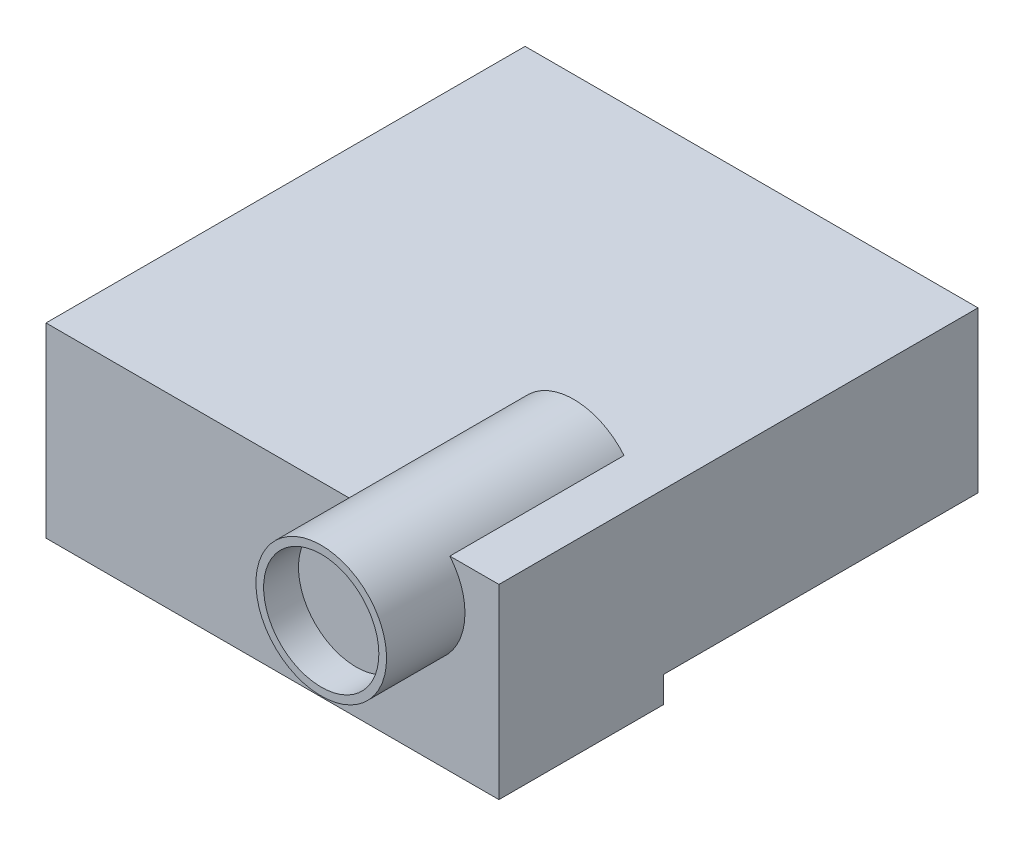
ISO-10303-21;
HEADER;
FILE_DESCRIPTION(('STEP AP214'),'2;1');
FILE_NAME('part.step','',(''),(''),'','','');
FILE_SCHEMA(('AUTOMOTIVE_DESIGN { 1 0 10303 214 1 1 1 1 }'));
ENDSEC;
DATA;
#1=APPLICATION_CONTEXT('core data for automotive mechanical design processes');
#2=APPLICATION_PROTOCOL_DEFINITION('international standard','automotive_design',2000,#1);
#3=PRODUCT_CONTEXT('',#1,'mechanical');
#4=PRODUCT('Part','Part','',(#3));
#5=PRODUCT_RELATED_PRODUCT_CATEGORY('part','',(#4));
#6=PRODUCT_DEFINITION_FORMATION('','',#4);
#7=PRODUCT_DEFINITION_CONTEXT('part definition',#1,'design');
#8=PRODUCT_DEFINITION('design','',#6,#7);
#9=PRODUCT_DEFINITION_SHAPE('','',#8);
#10=(LENGTH_UNIT() NAMED_UNIT(*) SI_UNIT(.MILLI.,.METRE.));
#11=(NAMED_UNIT(*) PLANE_ANGLE_UNIT() SI_UNIT($,.RADIAN.));
#12=(NAMED_UNIT(*) SI_UNIT($,.STERADIAN.) SOLID_ANGLE_UNIT());
#13=UNCERTAINTY_MEASURE_WITH_UNIT(LENGTH_MEASURE(1.E-05),#10,'distance_accuracy_value','');
#14=(GEOMETRIC_REPRESENTATION_CONTEXT(3) GLOBAL_UNCERTAINTY_ASSIGNED_CONTEXT((#13)) GLOBAL_UNIT_ASSIGNED_CONTEXT((#10,
#11,#12)) REPRESENTATION_CONTEXT('',''));
#15=CARTESIAN_POINT('',(0.,0.,0.));
#16=DIRECTION('',(0.,0.,1.));
#17=DIRECTION('',(1.,0.,0.));
#18=AXIS2_PLACEMENT_3D('',#15,#16,#17);
#19=CARTESIAN_POINT('',(0.,107.,0.));
#20=DIRECTION('',(1.,0.,0.));
#21=DIRECTION('',(0.,0.,-1.));
#22=AXIS2_PLACEMENT_3D('',#19,#20,#21);
#23=PLANE('',#22);
#24=DIRECTION('',(0.,0.,1.));
#25=VECTOR('',#24,1.);
#26=CARTESIAN_POINT('',(0.,15.,-275.));
#27=LINE('',#26,#25);
#28=CARTESIAN_POINT('',(0.,15.,-275.));
#29=VERTEX_POINT('',#28);
#30=CARTESIAN_POINT('',(0.,15.,-94.4841384510806));
#31=VERTEX_POINT('',#30);
#32=EDGE_CURVE('E141',#29,#31,#27,.T.);
#33=ORIENTED_EDGE('',*,*,#32,.T.);
#34=DIRECTION('',(0.,-1.,0.));
#35=VECTOR('',#34,1.);
#36=CARTESIAN_POINT('',(0.,15.,-94.4841384510806));
#37=LINE('',#36,#35);
#38=CARTESIAN_POINT('',(0.,0.,-94.4841384510806));
#39=VERTEX_POINT('',#38);
#40=EDGE_CURVE('E144',#31,#39,#37,.T.);
#41=ORIENTED_EDGE('',*,*,#40,.T.);
#42=DIRECTION('',(0.,0.,1.));
#43=VECTOR('',#42,1.);
#44=CARTESIAN_POINT('',(0.,0.,0.));
#45=LINE('',#44,#43);
#46=CARTESIAN_POINT('',(0.,0.,0.));
#47=VERTEX_POINT('',#46);
#48=EDGE_CURVE('E161',#39,#47,#45,.T.);
#49=ORIENTED_EDGE('',*,*,#48,.T.);
#50=DIRECTION('',(0.,-1.,0.));
#51=VECTOR('',#50,1.);
#52=CARTESIAN_POINT('',(0.,107.,0.));
#53=LINE('',#52,#51);
#54=CARTESIAN_POINT('',(0.,107.,0.));
#55=VERTEX_POINT('',#54);
#56=EDGE_CURVE('E188',#55,#47,#53,.T.);
#57=ORIENTED_EDGE('',*,*,#56,.F.);
#58=DIRECTION('',(0.,0.,1.));
#59=VECTOR('',#58,1.);
#60=CARTESIAN_POINT('',(0.,107.,0.));
#61=LINE('',#60,#59);
#62=CARTESIAN_POINT('',(0.,107.,-275.));
#63=VERTEX_POINT('',#62);
#64=EDGE_CURVE('E162',#63,#55,#61,.T.);
#65=ORIENTED_EDGE('',*,*,#64,.F.);
#66=DIRECTION('',(0.,-1.,0.));
#67=VECTOR('',#66,1.);
#68=CARTESIAN_POINT('',(0.,107.,-275.));
#69=LINE('',#68,#67);
#70=EDGE_CURVE('E174',#63,#29,#69,.T.);
#71=ORIENTED_EDGE('',*,*,#70,.T.);
#72=EDGE_LOOP('',(#33,#41,#49,#57,#65,#71));
#73=FACE_BOUND('',#72,.T.);
#74=ADVANCED_FACE('F40',(#73),#23,.F.);
#75=CARTESIAN_POINT('',(0.,107.,0.));
#76=DIRECTION('',(0.,0.,-1.));
#77=DIRECTION('',(-1.,0.,0.));
#78=AXIS2_PLACEMENT_3D('',#75,#76,#77);
#79=PLANE('',#78);
#80=DIRECTION('',(1.,0.,0.));
#81=VECTOR('',#80,1.);
#82=CARTESIAN_POINT('',(0.,107.,0.));
#83=LINE('',#82,#81);
#84=CARTESIAN_POINT('',(231.814059068448,107.,0.));
#85=VERTEX_POINT('',#84);
#86=CARTESIAN_POINT('',(260.,107.,0.));
#87=VERTEX_POINT('',#86);
#88=EDGE_CURVE('E165',#85,#87,#83,.T.);
#89=ORIENTED_EDGE('',*,*,#88,.F.);
#90=CARTESIAN_POINT('',(203.,83.,0.));
#91=DIRECTION('',(0.,0.,-1.));
#92=DIRECTION('',(-1.,0.,0.));
#93=AXIS2_PLACEMENT_3D('',#90,#91,#92);
#94=CIRCLE('',#93,37.5);
#95=CARTESIAN_POINT('',(174.185940931552,107.,0.));
#96=VERTEX_POINT('',#95);
#97=EDGE_CURVE('E159',#85,#96,#94,.T.);
#98=ORIENTED_EDGE('',*,*,#97,.T.);
#99=EDGE_CURVE('E167',#55,#96,#83,.T.);
#100=ORIENTED_EDGE('',*,*,#99,.F.);
#101=ORIENTED_EDGE('',*,*,#56,.T.);
#102=DIRECTION('',(1.,0.,0.));
#103=VECTOR('',#102,1.);
#104=CARTESIAN_POINT('',(0.,0.,0.));
#105=LINE('',#104,#103);
#106=CARTESIAN_POINT('',(260.,0.,0.));
#107=VERTEX_POINT('',#106);
#108=EDGE_CURVE('E176',#47,#107,#105,.T.);
#109=ORIENTED_EDGE('',*,*,#108,.T.);
#110=DIRECTION('',(0.,-1.,0.));
#111=VECTOR('',#110,1.);
#112=CARTESIAN_POINT('',(260.,107.,0.));
#113=LINE('',#112,#111);
#114=EDGE_CURVE('E185',#87,#107,#113,.T.);
#115=ORIENTED_EDGE('',*,*,#114,.F.);
#116=EDGE_LOOP('',(#89,#98,#100,#101,#109,#115));
#117=FACE_BOUND('',#116,.T.);
#118=ADVANCED_FACE('F200',(#117),#79,.F.);
#119=CARTESIAN_POINT('',(260.,107.,0.));
#120=DIRECTION('',(-1.,0.,0.));
#121=DIRECTION('',(0.,0.,1.));
#122=AXIS2_PLACEMENT_3D('',#119,#120,#121);
#123=PLANE('',#122);
#124=DIRECTION('',(0.,0.,-1.));
#125=VECTOR('',#124,1.);
#126=CARTESIAN_POINT('',(260.,0.,0.));
#127=LINE('',#126,#125);
#128=CARTESIAN_POINT('',(260.,0.,-94.4841384510806));
#129=VERTEX_POINT('',#128);
#130=EDGE_CURVE('E166',#107,#129,#127,.T.);
#131=ORIENTED_EDGE('',*,*,#130,.T.);
#132=DIRECTION('',(0.,-1.,0.));
#133=VECTOR('',#132,1.);
#134=CARTESIAN_POINT('',(260.,15.,-94.4841384510806));
#135=LINE('',#134,#133);
#136=CARTESIAN_POINT('',(260.,15.,-94.4841384510806));
#137=VERTEX_POINT('',#136);
#138=EDGE_CURVE('E54',#137,#129,#135,.T.);
#139=ORIENTED_EDGE('',*,*,#138,.F.);
#140=DIRECTION('',(0.,0.,1.));
#141=VECTOR('',#140,1.);
#142=CARTESIAN_POINT('',(260.,15.,-275.));
#143=LINE('',#142,#141);
#144=CARTESIAN_POINT('',(260.,15.,-275.));
#145=VERTEX_POINT('',#144);
#146=EDGE_CURVE('E140',#145,#137,#143,.T.);
#147=ORIENTED_EDGE('',*,*,#146,.F.);
#148=DIRECTION('',(0.,-1.,0.));
#149=VECTOR('',#148,1.);
#150=CARTESIAN_POINT('',(260.,107.,-275.));
#151=LINE('',#150,#149);
#152=CARTESIAN_POINT('',(260.,107.,-275.));
#153=VERTEX_POINT('',#152);
#154=EDGE_CURVE('E182',#153,#145,#151,.T.);
#155=ORIENTED_EDGE('',*,*,#154,.F.);
#156=DIRECTION('',(0.,0.,-1.));
#157=VECTOR('',#156,1.);
#158=CARTESIAN_POINT('',(260.,107.,0.));
#159=LINE('',#158,#157);
#160=EDGE_CURVE('E170',#87,#153,#159,.T.);
#161=ORIENTED_EDGE('',*,*,#160,.F.);
#162=ORIENTED_EDGE('',*,*,#114,.T.);
#163=EDGE_LOOP('',(#131,#139,#147,#155,#161,#162));
#164=FACE_BOUND('',#163,.T.);
#165=ADVANCED_FACE('F224',(#164),#123,.F.);
#166=CARTESIAN_POINT('',(0.,107.,-275.));
#167=DIRECTION('',(0.,0.,1.));
#168=DIRECTION('',(1.,0.,0.));
#169=AXIS2_PLACEMENT_3D('',#166,#167,#168);
#170=PLANE('',#169);
#171=ORIENTED_EDGE('',*,*,#154,.T.);
#172=DIRECTION('',(1.,0.,0.));
#173=VECTOR('',#172,1.);
#174=CARTESIAN_POINT('',(0.,15.,-275.));
#175=LINE('',#174,#173);
#176=EDGE_CURVE('E147',#29,#145,#175,.T.);
#177=ORIENTED_EDGE('',*,*,#176,.F.);
#178=ORIENTED_EDGE('',*,*,#70,.F.);
#179=DIRECTION('',(-1.,0.,0.));
#180=VECTOR('',#179,1.);
#181=CARTESIAN_POINT('',(0.,107.,-275.));
#182=LINE('',#181,#180);
#183=EDGE_CURVE('E172',#153,#63,#182,.T.);
#184=ORIENTED_EDGE('',*,*,#183,.F.);
#185=EDGE_LOOP('',(#171,#177,#178,#184));
#186=FACE_BOUND('',#185,.T.);
#187=ADVANCED_FACE('F233',(#186),#170,.F.);
#188=CARTESIAN_POINT('',(0.,107.,0.));
#189=DIRECTION('',(0.,-1.,0.));
#190=DIRECTION('',(0.,0.,-1.));
#191=AXIS2_PLACEMENT_3D('',#188,#189,#190);
#192=PLANE('',#191);
#193=DIRECTION('',(-1.,0.,0.));
#194=VECTOR('',#193,1.);
#195=CARTESIAN_POINT('',(0.,107.,-100.));
#196=LINE('',#195,#194);
#197=CARTESIAN_POINT('',(231.814059068448,107.,-100.));
#198=VERTEX_POINT('',#197);
#199=CARTESIAN_POINT('',(174.185940931552,107.,-100.));
#200=VERTEX_POINT('',#199);
#201=EDGE_CURVE('E62',#198,#200,#196,.T.);
#202=ORIENTED_EDGE('',*,*,#201,.F.);
#203=DIRECTION('',(0.,0.,1.));
#204=VECTOR('',#203,1.);
#205=CARTESIAN_POINT('',(231.814059068448,107.,-100.));
#206=LINE('',#205,#204);
#207=EDGE_CURVE('E47',#198,#85,#206,.T.);
#208=ORIENTED_EDGE('',*,*,#207,.T.);
#209=ORIENTED_EDGE('',*,*,#88,.T.);
#210=ORIENTED_EDGE('',*,*,#160,.T.);
#211=ORIENTED_EDGE('',*,*,#183,.T.);
#212=ORIENTED_EDGE('',*,*,#64,.T.);
#213=ORIENTED_EDGE('',*,*,#99,.T.);
#214=DIRECTION('',(0.,0.,1.));
#215=VECTOR('',#214,1.);
#216=CARTESIAN_POINT('',(174.185940931552,107.,-100.));
#217=LINE('',#216,#215);
#218=EDGE_CURVE('E192',#96,#200,#217,.F.);
#219=ORIENTED_EDGE('',*,*,#218,.T.);
#220=EDGE_LOOP('',(#202,#208,#209,#210,#211,#212,#213,#219));
#221=FACE_BOUND('',#220,.T.);
#222=ADVANCED_FACE('F194',(#221),#192,.F.);
#223=CARTESIAN_POINT('',(0.,0.,0.));
#224=DIRECTION('',(0.,-1.,0.));
#225=DIRECTION('',(0.,0.,-1.));
#226=AXIS2_PLACEMENT_3D('',#223,#224,#225);
#227=PLANE('',#226);
#228=CARTESIAN_POINT('',(142.,0.,-47.));
#229=DIRECTION('',(0.,-1.,0.));
#230=DIRECTION('',(0.,0.,-1.));
#231=AXIS2_PLACEMENT_3D('',#228,#229,#230);
#232=CIRCLE('',#231,1.64999999999998);
#233=CARTESIAN_POINT('',(142.,0.,-48.65));
#234=VERTEX_POINT('',#233);
#235=EDGE_CURVE('E122',#234,#234,#232,.T.);
#236=ORIENTED_EDGE('',*,*,#235,.F.);
#237=EDGE_LOOP('',(#236));
#238=FACE_BOUND('',#237,.T.);
#239=DIRECTION('',(1.,0.,0.));
#240=VECTOR('',#239,1.);
#241=CARTESIAN_POINT('',(0.,0.,-94.4841384510806));
#242=LINE('',#241,#240);
#243=EDGE_CURVE('E151',#39,#129,#242,.T.);
#244=ORIENTED_EDGE('',*,*,#243,.T.);
#245=ORIENTED_EDGE('',*,*,#130,.F.);
#246=ORIENTED_EDGE('',*,*,#108,.F.);
#247=ORIENTED_EDGE('',*,*,#48,.F.);
#248=EDGE_LOOP('',(#244,#245,#246,#247));
#249=FACE_BOUND('',#248,.T.);
#250=ADVANCED_FACE('F216',(#238,#249),#227,.T.);
#251=CARTESIAN_POINT('',(203.,83.,-100.));
#252=DIRECTION('',(0.,0.,1.));
#253=DIRECTION('',(1.,0.,0.));
#254=AXIS2_PLACEMENT_3D('',#251,#252,#253);
#255=CYLINDRICAL_SURFACE('',#254,37.5);
#256=ORIENTED_EDGE('',*,*,#207,.F.);
#257=CARTESIAN_POINT('',(203.,83.,-100.));
#258=DIRECTION('',(0.,0.,1.));
#259=DIRECTION('',(1.,0.,0.));
#260=AXIS2_PLACEMENT_3D('',#257,#258,#259);
#261=CIRCLE('',#260,37.5);
#262=EDGE_CURVE('E153',#198,#200,#261,.T.);
#263=ORIENTED_EDGE('',*,*,#262,.T.);
#264=ORIENTED_EDGE('',*,*,#218,.F.);
#265=ORIENTED_EDGE('',*,*,#97,.F.);
#266=EDGE_LOOP('',(#256,#263,#264,#265));
#267=FACE_BOUND('',#266,.T.);
#268=CARTESIAN_POINT('',(203.,83.,45.));
#269=DIRECTION('',(0.,0.,1.));
#270=DIRECTION('',(1.,0.,0.));
#271=AXIS2_PLACEMENT_3D('',#268,#269,#270);
#272=CIRCLE('',#271,37.5);
#273=CARTESIAN_POINT('',(240.5,83.,45.));
#274=VERTEX_POINT('',#273);
#275=EDGE_CURVE('E128',#274,#274,#272,.T.);
#276=ORIENTED_EDGE('',*,*,#275,.F.);
#277=EDGE_LOOP('',(#276));
#278=FACE_BOUND('',#277,.T.);
#279=ADVANCED_FACE('F203',(#267,#278),#255,.T.);
#280=CARTESIAN_POINT('',(203.,83.,-100.));
#281=DIRECTION('',(0.,0.,1.));
#282=DIRECTION('',(1.,0.,0.));
#283=AXIS2_PLACEMENT_3D('',#280,#281,#282);
#284=PLANE('',#283);
#285=ORIENTED_EDGE('',*,*,#262,.F.);
#286=ORIENTED_EDGE('',*,*,#201,.T.);
#287=EDGE_LOOP('',(#285,#286));
#288=FACE_BOUND('',#287,.T.);
#289=ADVANCED_FACE('F206',(#288),#284,.F.);
#290=CARTESIAN_POINT('',(0.,15.,-94.4841384510806));
#291=DIRECTION('',(0.,0.,1.));
#292=DIRECTION('',(1.,0.,0.));
#293=AXIS2_PLACEMENT_3D('',#290,#291,#292);
#294=PLANE('',#293);
#295=ORIENTED_EDGE('',*,*,#138,.T.);
#296=ORIENTED_EDGE('',*,*,#243,.F.);
#297=ORIENTED_EDGE('',*,*,#40,.F.);
#298=DIRECTION('',(1.,0.,0.));
#299=VECTOR('',#298,1.);
#300=CARTESIAN_POINT('',(0.,15.,-94.4841384510806));
#301=LINE('',#300,#299);
#302=EDGE_CURVE('E154',#31,#137,#301,.T.);
#303=ORIENTED_EDGE('',*,*,#302,.T.);
#304=EDGE_LOOP('',(#295,#296,#297,#303));
#305=FACE_BOUND('',#304,.T.);
#306=ADVANCED_FACE('F208',(#305),#294,.F.);
#307=CARTESIAN_POINT('',(0.,15.,-275.));
#308=DIRECTION('',(0.,1.,0.));
#309=DIRECTION('',(0.,0.,1.));
#310=AXIS2_PLACEMENT_3D('',#307,#308,#309);
#311=PLANE('',#310);
#312=CARTESIAN_POINT('',(36.,15.,-235.));
#313=DIRECTION('',(0.,-1.,0.));
#314=DIRECTION('',(0.,0.,-1.));
#315=AXIS2_PLACEMENT_3D('',#312,#313,#314);
#316=CIRCLE('',#315,1.65);
#317=CARTESIAN_POINT('',(36.,15.,-236.65));
#318=VERTEX_POINT('',#317);
#319=EDGE_CURVE('E121',#318,#318,#316,.T.);
#320=ORIENTED_EDGE('',*,*,#319,.F.);
#321=EDGE_LOOP('',(#320));
#322=FACE_BOUND('',#321,.T.);
#323=CARTESIAN_POINT('',(209.,15.,-235.));
#324=DIRECTION('',(0.,-1.,0.));
#325=DIRECTION('',(0.,0.,-1.));
#326=AXIS2_PLACEMENT_3D('',#323,#324,#325);
#327=CIRCLE('',#326,1.64999999999998);
#328=CARTESIAN_POINT('',(209.,15.,-236.65));
#329=VERTEX_POINT('',#328);
#330=EDGE_CURVE('E134',#329,#329,#327,.T.);
#331=ORIENTED_EDGE('',*,*,#330,.F.);
#332=EDGE_LOOP('',(#331));
#333=FACE_BOUND('',#332,.T.);
#334=ORIENTED_EDGE('',*,*,#146,.T.);
#335=ORIENTED_EDGE('',*,*,#302,.F.);
#336=ORIENTED_EDGE('',*,*,#32,.F.);
#337=ORIENTED_EDGE('',*,*,#176,.T.);
#338=EDGE_LOOP('',(#334,#335,#336,#337));
#339=FACE_BOUND('',#338,.T.);
#340=ADVANCED_FACE('F214',(#322,#333,#339),#311,.F.);
#341=CARTESIAN_POINT('',(209.,26.5,-235.));
#342=DIRECTION('',(0.,-1.,0.));
#343=DIRECTION('',(0.,0.,-1.));
#344=AXIS2_PLACEMENT_3D('',#341,#342,#343);
#345=CONICAL_SURFACE('',#344,1.64999999999998,1.02974425867665);
#346=CARTESIAN_POINT('',(209.,27.4914200213955,-235.));
#347=VERTEX_POINT('',#346);
#348=VERTEX_LOOP('',#347);
#349=FACE_BOUND('',#348,.T.);
#350=CARTESIAN_POINT('',(209.,26.5,-235.));
#351=DIRECTION('',(0.,-1.,0.));
#352=DIRECTION('',(0.,0.,-1.));
#353=AXIS2_PLACEMENT_3D('',#350,#351,#352);
#354=CIRCLE('',#353,1.64999999999998);
#355=CARTESIAN_POINT('',(209.,26.5,-236.65));
#356=VERTEX_POINT('',#355);
#357=EDGE_CURVE('E137',#356,#356,#354,.T.);
#358=ORIENTED_EDGE('',*,*,#357,.T.);
#359=EDGE_LOOP('',(#358));
#360=FACE_BOUND('',#359,.T.);
#361=ADVANCED_FACE('F311',(#349,#360),#345,.F.);
#362=CARTESIAN_POINT('',(209.,15.,-235.));
#363=DIRECTION('',(0.,-1.,0.));
#364=DIRECTION('',(0.,0.,-1.));
#365=AXIS2_PLACEMENT_3D('',#362,#363,#364);
#366=CYLINDRICAL_SURFACE('',#365,1.64999999999998);
#367=ORIENTED_EDGE('',*,*,#357,.F.);
#368=EDGE_LOOP('',(#367));
#369=FACE_BOUND('',#368,.T.);
#370=ORIENTED_EDGE('',*,*,#330,.T.);
#371=EDGE_LOOP('',(#370));
#372=FACE_BOUND('',#371,.T.);
#373=ADVANCED_FACE('F320',(#369,#372),#366,.F.);
#374=CARTESIAN_POINT('',(36.,26.5,-235.));
#375=DIRECTION('',(0.,-1.,0.));
#376=DIRECTION('',(0.,0.,-1.));
#377=AXIS2_PLACEMENT_3D('',#374,#375,#376);
#378=CONICAL_SURFACE('',#377,1.65,1.02974425867665);
#379=CARTESIAN_POINT('',(36.,27.4914200213955,-235.));
#380=VERTEX_POINT('',#379);
#381=VERTEX_LOOP('',#380);
#382=FACE_BOUND('',#381,.T.);
#383=CARTESIAN_POINT('',(36.,26.5,-235.));
#384=DIRECTION('',(0.,-1.,0.));
#385=DIRECTION('',(0.,0.,-1.));
#386=AXIS2_PLACEMENT_3D('',#383,#384,#385);
#387=CIRCLE('',#386,1.65);
#388=CARTESIAN_POINT('',(36.,26.5,-236.65));
#389=VERTEX_POINT('',#388);
#390=EDGE_CURVE('E125',#389,#389,#387,.T.);
#391=ORIENTED_EDGE('',*,*,#390,.T.);
#392=EDGE_LOOP('',(#391));
#393=FACE_BOUND('',#392,.T.);
#394=ADVANCED_FACE('F329',(#382,#393),#378,.F.);
#395=CARTESIAN_POINT('',(36.,15.,-235.));
#396=DIRECTION('',(0.,-1.,0.));
#397=DIRECTION('',(0.,0.,-1.));
#398=AXIS2_PLACEMENT_3D('',#395,#396,#397);
#399=CYLINDRICAL_SURFACE('',#398,1.65);
#400=ORIENTED_EDGE('',*,*,#390,.F.);
#401=EDGE_LOOP('',(#400));
#402=FACE_BOUND('',#401,.T.);
#403=ORIENTED_EDGE('',*,*,#319,.T.);
#404=EDGE_LOOP('',(#403));
#405=FACE_BOUND('',#404,.T.);
#406=ADVANCED_FACE('F115',(#402,#405),#399,.F.);
#407=CARTESIAN_POINT('',(142.,11.5,-47.));
#408=DIRECTION('',(0.,-1.,0.));
#409=DIRECTION('',(0.,0.,-1.));
#410=AXIS2_PLACEMENT_3D('',#407,#408,#409);
#411=CONICAL_SURFACE('',#410,1.64999999999998,1.02974425867665);
#412=CARTESIAN_POINT('',(142.,12.4914200213955,-47.));
#413=VERTEX_POINT('',#412);
#414=VERTEX_LOOP('',#413);
#415=FACE_BOUND('',#414,.T.);
#416=CARTESIAN_POINT('',(142.,11.5,-47.));
#417=DIRECTION('',(0.,-1.,0.));
#418=DIRECTION('',(0.,0.,-1.));
#419=AXIS2_PLACEMENT_3D('',#416,#417,#418);
#420=CIRCLE('',#419,1.64999999999998);
#421=CARTESIAN_POINT('',(142.,11.5,-48.65));
#422=VERTEX_POINT('',#421);
#423=EDGE_CURVE('E119',#422,#422,#420,.T.);
#424=ORIENTED_EDGE('',*,*,#423,.T.);
#425=EDGE_LOOP('',(#424));
#426=FACE_BOUND('',#425,.T.);
#427=ADVANCED_FACE('F111',(#415,#426),#411,.F.);
#428=CARTESIAN_POINT('',(142.,0.,-47.));
#429=DIRECTION('',(0.,-1.,0.));
#430=DIRECTION('',(0.,0.,-1.));
#431=AXIS2_PLACEMENT_3D('',#428,#429,#430);
#432=CYLINDRICAL_SURFACE('',#431,1.64999999999998);
#433=ORIENTED_EDGE('',*,*,#423,.F.);
#434=EDGE_LOOP('',(#433));
#435=FACE_BOUND('',#434,.T.);
#436=ORIENTED_EDGE('',*,*,#235,.T.);
#437=EDGE_LOOP('',(#436));
#438=FACE_BOUND('',#437,.T.);
#439=ADVANCED_FACE('F114',(#435,#438),#432,.F.);
#440=CARTESIAN_POINT('',(203.,83.,45.));
#441=DIRECTION('',(0.,0.,1.));
#442=DIRECTION('',(1.,0.,0.));
#443=AXIS2_PLACEMENT_3D('',#440,#441,#442);
#444=PLANE('',#443);
#445=ORIENTED_EDGE('',*,*,#275,.T.);
#446=EDGE_LOOP('',(#445));
#447=FACE_BOUND('',#446,.T.);
#448=CARTESIAN_POINT('',(203.,83.,45.));
#449=DIRECTION('',(0.,0.,1.));
#450=DIRECTION('',(1.,0.,0.));
#451=AXIS2_PLACEMENT_3D('',#448,#449,#450);
#452=CIRCLE('',#451,33.0673868675688);
#453=CARTESIAN_POINT('',(236.067386867569,83.,45.));
#454=VERTEX_POINT('',#453);
#455=EDGE_CURVE('E406',#454,#454,#452,.T.);
#456=ORIENTED_EDGE('',*,*,#455,.F.);
#457=EDGE_LOOP('',(#456));
#458=FACE_BOUND('',#457,.T.);
#459=ADVANCED_FACE('F360',(#447,#458),#444,.T.);
#460=CARTESIAN_POINT('',(203.,83.,45.));
#461=DIRECTION('',(0.,0.,-1.));
#462=DIRECTION('',(-1.,0.,0.));
#463=AXIS2_PLACEMENT_3D('',#460,#461,#462);
#464=CYLINDRICAL_SURFACE('',#463,33.0673868675688);
#465=ORIENTED_EDGE('',*,*,#455,.T.);
#466=EDGE_LOOP('',(#465));
#467=FACE_BOUND('',#466,.T.);
#468=CARTESIAN_POINT('',(203.,83.,25.));
#469=DIRECTION('',(0.,0.,1.));
#470=DIRECTION('',(1.,0.,0.));
#471=AXIS2_PLACEMENT_3D('',#468,#469,#470);
#472=CIRCLE('',#471,33.0673868675688);
#473=CARTESIAN_POINT('',(236.067386867569,83.,25.));
#474=VERTEX_POINT('',#473);
#475=EDGE_CURVE('E11',#474,#474,#472,.F.);
#476=ORIENTED_EDGE('',*,*,#475,.T.);
#477=EDGE_LOOP('',(#476));
#478=FACE_BOUND('',#477,.T.);
#479=ADVANCED_FACE('F298',(#467,#478),#464,.F.);
#480=CARTESIAN_POINT('',(203.,83.,25.));
#481=DIRECTION('',(0.,0.,1.));
#482=DIRECTION('',(1.,0.,0.));
#483=AXIS2_PLACEMENT_3D('',#480,#481,#482);
#484=PLANE('',#483);
#485=ORIENTED_EDGE('',*,*,#475,.F.);
#486=EDGE_LOOP('',(#485));
#487=FACE_BOUND('',#486,.T.);
#488=ADVANCED_FACE('F292',(#487),#484,.T.);
#489=CLOSED_SHELL('',(#74,#118,#165,#187,#222,#250,#279,#289,#306,#340,#361,#373,#394,#406,#427,
#439,#459,#479,#488));
#490=MANIFOLD_SOLID_BREP('B2',#489);
#491=ADVANCED_BREP_SHAPE_REPRESENTATION('',(#18,#490),#14);
#492=SHAPE_DEFINITION_REPRESENTATION(#9,#491);
ENDSEC;
END-ISO-10303-21;
